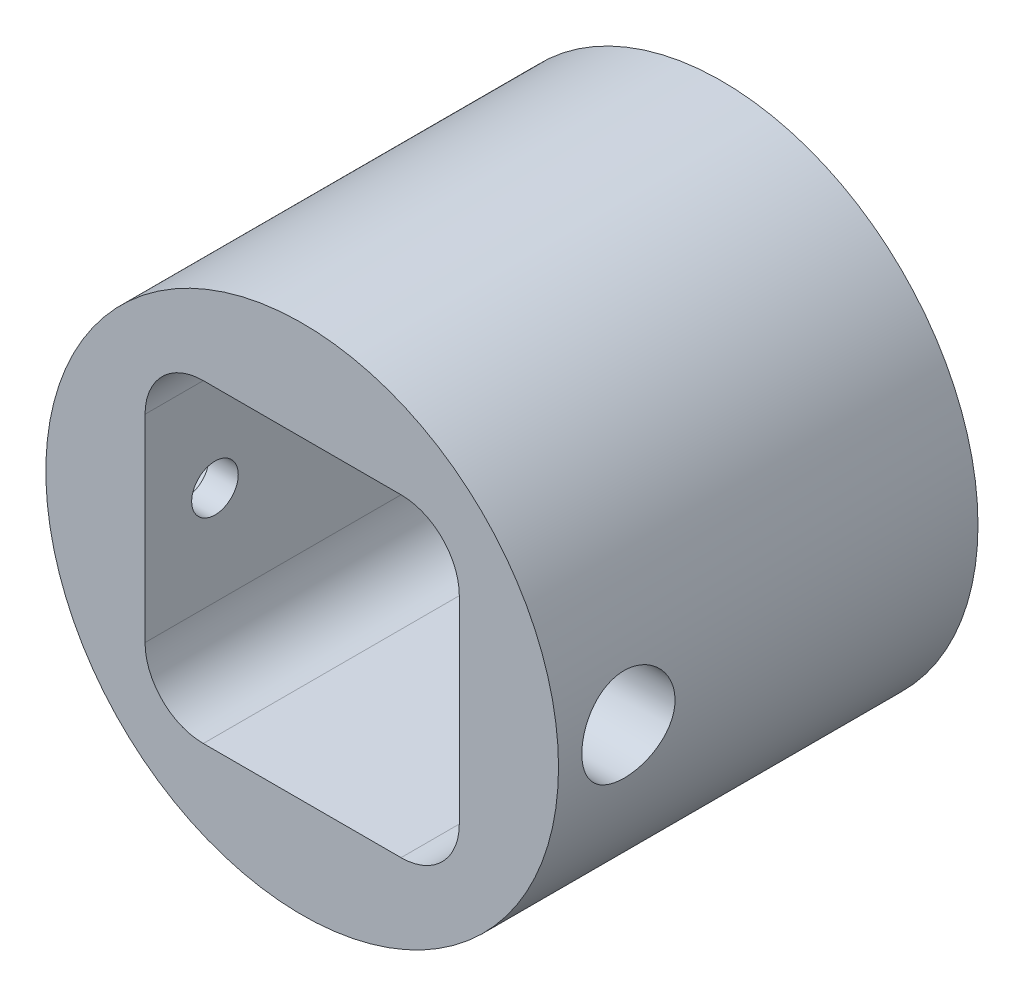
ISO-10303-21;
HEADER;
FILE_DESCRIPTION(('STEP AP214'),'2;1');
FILE_NAME('part.step','',(''),(''),'','','');
FILE_SCHEMA(('AUTOMOTIVE_DESIGN { 1 0 10303 214 1 1 1 1 }'));
ENDSEC;
DATA;
#1=APPLICATION_CONTEXT('core data for automotive mechanical design processes');
#2=APPLICATION_PROTOCOL_DEFINITION('international standard','automotive_design',2000,#1);
#3=PRODUCT_CONTEXT('',#1,'mechanical');
#4=PRODUCT('Part','Part','',(#3));
#5=PRODUCT_RELATED_PRODUCT_CATEGORY('part','',(#4));
#6=PRODUCT_DEFINITION_FORMATION('','',#4);
#7=PRODUCT_DEFINITION_CONTEXT('part definition',#1,'design');
#8=PRODUCT_DEFINITION('design','',#6,#7);
#9=PRODUCT_DEFINITION_SHAPE('','',#8);
#10=(LENGTH_UNIT() NAMED_UNIT(*) SI_UNIT(.MILLI.,.METRE.));
#11=(NAMED_UNIT(*) PLANE_ANGLE_UNIT() SI_UNIT($,.RADIAN.));
#12=(NAMED_UNIT(*) SI_UNIT($,.STERADIAN.) SOLID_ANGLE_UNIT());
#13=UNCERTAINTY_MEASURE_WITH_UNIT(LENGTH_MEASURE(1.E-05),#10,'distance_accuracy_value','');
#14=(GEOMETRIC_REPRESENTATION_CONTEXT(3) GLOBAL_UNCERTAINTY_ASSIGNED_CONTEXT((#13)) GLOBAL_UNIT_ASSIGNED_CONTEXT((#10,
#11,#12)) REPRESENTATION_CONTEXT('',''));
#15=CARTESIAN_POINT('',(0.,0.,0.));
#16=DIRECTION('',(0.,0.,1.));
#17=DIRECTION('',(1.,0.,0.));
#18=AXIS2_PLACEMENT_3D('',#15,#16,#17);
#19=CARTESIAN_POINT('',(-11.,0.,15.));
#20=DIRECTION('',(1.,0.,0.));
#21=DIRECTION('',(0.,0.,-1.));
#22=AXIS2_PLACEMENT_3D('',#19,#20,#21);
#23=CYLINDRICAL_SURFACE('',#22,0.999999999999998);
#24=CARTESIAN_POINT('',(8.,0.,15.));
#25=DIRECTION('',(1.,0.,0.));
#26=DIRECTION('',(0.,0.,-1.));
#27=AXIS2_PLACEMENT_3D('',#24,#25,#26);
#28=CIRCLE('',#27,0.999999999999998);
#29=CARTESIAN_POINT('',(8.,0.,14.));
#30=VERTEX_POINT('',#29);
#31=EDGE_CURVE('E186',#30,#30,#28,.F.);
#32=ORIENTED_EDGE('',*,*,#31,.F.);
#33=EDGE_LOOP('',(#32));
#34=FACE_BOUND('',#33,.T.);
#35=CARTESIAN_POINT('',(6.74264068711935,0.,15.));
#36=DIRECTION('',(-1.,0.,0.));
#37=DIRECTION('',(0.,-1.,0.));
#38=AXIS2_PLACEMENT_3D('',#35,#36,#37);
#39=CIRCLE('',#38,0.999999999999998);
#40=CARTESIAN_POINT('',(6.74264068711935,-0.999999999999998,15.));
#41=VERTEX_POINT('',#40);
#42=EDGE_CURVE('E177',#41,#41,#39,.F.);
#43=ORIENTED_EDGE('',*,*,#42,.F.);
#44=EDGE_LOOP('',(#43));
#45=FACE_BOUND('',#44,.T.);
#46=ADVANCED_FACE('F37',(#34,#45),#23,.F.);
#47=CARTESIAN_POINT('',(-4.24264068711929,4.24264068711928,18.));
#48=DIRECTION('',(0.,0.,-1.));
#49=DIRECTION('',(-1.,0.,0.));
#50=AXIS2_PLACEMENT_3D('',#47,#48,#49);
#51=CYLINDRICAL_SURFACE('',#50,1.5);
#52=CARTESIAN_POINT('',(-4.24264068711929,4.24264068711928,0.));
#53=DIRECTION('',(0.,0.,1.));
#54=DIRECTION('',(1.,0.,0.));
#55=AXIS2_PLACEMENT_3D('',#52,#53,#54);
#56=CIRCLE('',#55,1.5);
#57=CARTESIAN_POINT('',(-2.74264068711929,4.24264068711928,0.));
#58=VERTEX_POINT('',#57);
#59=EDGE_CURVE('E202',#58,#58,#56,.T.);
#60=ORIENTED_EDGE('',*,*,#59,.F.);
#61=EDGE_LOOP('',(#60));
#62=FACE_BOUND('',#61,.T.);
#63=CARTESIAN_POINT('',(-4.24264068711929,4.24264068711928,2.));
#64=DIRECTION('',(0.,0.,1.));
#65=DIRECTION('',(1.,0.,0.));
#66=AXIS2_PLACEMENT_3D('',#63,#64,#65);
#67=CIRCLE('',#66,1.5);
#68=CARTESIAN_POINT('',(-2.74264068711929,4.24264068711928,2.));
#69=VERTEX_POINT('',#68);
#70=EDGE_CURVE('E174',#69,#69,#67,.T.);
#71=ORIENTED_EDGE('',*,*,#70,.T.);
#72=EDGE_LOOP('',(#71));
#73=FACE_BOUND('',#72,.T.);
#74=ADVANCED_FACE('F240',(#62,#73),#51,.F.);
#75=CARTESIAN_POINT('',(4.24264068711928,4.2426406871194,18.));
#76=DIRECTION('',(0.,0.,-1.));
#77=DIRECTION('',(-1.,0.,0.));
#78=AXIS2_PLACEMENT_3D('',#75,#76,#77);
#79=CYLINDRICAL_SURFACE('',#78,1.5);
#80=CARTESIAN_POINT('',(4.24264068711928,4.2426406871194,0.));
#81=DIRECTION('',(0.,0.,1.));
#82=DIRECTION('',(1.,0.,0.));
#83=AXIS2_PLACEMENT_3D('',#80,#81,#82);
#84=CIRCLE('',#83,1.5);
#85=CARTESIAN_POINT('',(5.74264068711929,4.2426406871194,0.));
#86=VERTEX_POINT('',#85);
#87=EDGE_CURVE('E199',#86,#86,#84,.T.);
#88=ORIENTED_EDGE('',*,*,#87,.F.);
#89=EDGE_LOOP('',(#88));
#90=FACE_BOUND('',#89,.T.);
#91=CARTESIAN_POINT('',(4.24264068711928,4.2426406871194,2.));
#92=DIRECTION('',(0.,0.,1.));
#93=DIRECTION('',(1.,0.,0.));
#94=AXIS2_PLACEMENT_3D('',#91,#92,#93);
#95=CIRCLE('',#94,1.5);
#96=CARTESIAN_POINT('',(5.74264068711929,4.2426406871194,2.));
#97=VERTEX_POINT('',#96);
#98=EDGE_CURVE('E171',#97,#97,#95,.T.);
#99=ORIENTED_EDGE('',*,*,#98,.T.);
#100=EDGE_LOOP('',(#99));
#101=FACE_BOUND('',#100,.T.);
#102=ADVANCED_FACE('F236',(#90,#101),#79,.F.);
#103=CARTESIAN_POINT('',(4.2426406871194,-4.24264068711917,18.));
#104=DIRECTION('',(0.,0.,-1.));
#105=DIRECTION('',(-1.,0.,0.));
#106=AXIS2_PLACEMENT_3D('',#103,#104,#105);
#107=CYLINDRICAL_SURFACE('',#106,1.5);
#108=CARTESIAN_POINT('',(4.2426406871194,-4.24264068711917,0.));
#109=DIRECTION('',(0.,0.,1.));
#110=DIRECTION('',(1.,0.,0.));
#111=AXIS2_PLACEMENT_3D('',#108,#109,#110);
#112=CIRCLE('',#111,1.5);
#113=CARTESIAN_POINT('',(5.7426406871194,-4.24264068711917,0.));
#114=VERTEX_POINT('',#113);
#115=EDGE_CURVE('E195',#114,#114,#112,.T.);
#116=ORIENTED_EDGE('',*,*,#115,.F.);
#117=EDGE_LOOP('',(#116));
#118=FACE_BOUND('',#117,.T.);
#119=CARTESIAN_POINT('',(4.2426406871194,-4.24264068711917,2.));
#120=DIRECTION('',(0.,0.,1.));
#121=DIRECTION('',(1.,0.,0.));
#122=AXIS2_PLACEMENT_3D('',#119,#120,#121);
#123=CIRCLE('',#122,1.5);
#124=CARTESIAN_POINT('',(5.7426406871194,-4.24264068711917,2.));
#125=VERTEX_POINT('',#124);
#126=EDGE_CURVE('E168',#125,#125,#123,.T.);
#127=ORIENTED_EDGE('',*,*,#126,.T.);
#128=EDGE_LOOP('',(#127));
#129=FACE_BOUND('',#128,.T.);
#130=ADVANCED_FACE('F232',(#118,#129),#107,.F.);
#131=CARTESIAN_POINT('',(-4.24264068711917,-4.24264068711929,18.));
#132=DIRECTION('',(0.,0.,-1.));
#133=DIRECTION('',(-1.,0.,0.));
#134=AXIS2_PLACEMENT_3D('',#131,#132,#133);
#135=CYLINDRICAL_SURFACE('',#134,1.5);
#136=CARTESIAN_POINT('',(-4.24264068711917,-4.24264068711929,0.));
#137=DIRECTION('',(0.,0.,1.));
#138=DIRECTION('',(1.,0.,0.));
#139=AXIS2_PLACEMENT_3D('',#136,#137,#138);
#140=CIRCLE('',#139,1.5);
#141=CARTESIAN_POINT('',(-2.74264068711917,-4.24264068711929,0.));
#142=VERTEX_POINT('',#141);
#143=EDGE_CURVE('E192',#142,#142,#140,.T.);
#144=ORIENTED_EDGE('',*,*,#143,.F.);
#145=EDGE_LOOP('',(#144));
#146=FACE_BOUND('',#145,.T.);
#147=CARTESIAN_POINT('',(-4.24264068711917,-4.24264068711929,2.));
#148=DIRECTION('',(0.,0.,1.));
#149=DIRECTION('',(1.,0.,0.));
#150=AXIS2_PLACEMENT_3D('',#147,#148,#149);
#151=CIRCLE('',#150,1.5);
#152=CARTESIAN_POINT('',(-2.74264068711917,-4.24264068711929,2.));
#153=VERTEX_POINT('',#152);
#154=EDGE_CURVE('E42',#153,#153,#151,.T.);
#155=ORIENTED_EDGE('',*,*,#154,.T.);
#156=EDGE_LOOP('',(#155));
#157=FACE_BOUND('',#156,.T.);
#158=ADVANCED_FACE('F229',(#146,#157),#135,.F.);
#159=CARTESIAN_POINT('',(0.,0.,18.));
#160=DIRECTION('',(0.,0.,-1.));
#161=DIRECTION('',(-1.,0.,0.));
#162=AXIS2_PLACEMENT_3D('',#159,#160,#161);
#163=CYLINDRICAL_SURFACE('',#162,11.);
#164=CARTESIAN_POINT('',(0.,0.,0.));
#165=DIRECTION('',(0.,0.,1.));
#166=DIRECTION('',(1.,0.,0.));
#167=AXIS2_PLACEMENT_3D('',#164,#165,#166);
#168=CIRCLE('',#167,11.);
#169=CARTESIAN_POINT('',(11.,0.,0.));
#170=VERTEX_POINT('',#169);
#171=EDGE_CURVE('E47',#170,#170,#168,.T.);
#172=ORIENTED_EDGE('',*,*,#171,.T.);
#173=EDGE_LOOP('',(#172));
#174=FACE_BOUND('',#173,.T.);
#175=CARTESIAN_POINT('',(0.,0.,18.));
#176=DIRECTION('',(0.,0.,1.));
#177=DIRECTION('',(1.,0.,0.));
#178=AXIS2_PLACEMENT_3D('',#175,#176,#177);
#179=CIRCLE('',#178,11.);
#180=CARTESIAN_POINT('',(11.,0.,18.));
#181=VERTEX_POINT('',#180);
#182=EDGE_CURVE('E11',#181,#181,#179,.T.);
#183=ORIENTED_EDGE('',*,*,#182,.F.);
#184=EDGE_LOOP('',(#183));
#185=FACE_BOUND('',#184,.T.);
#186=CARTESIAN_POINT('',(-11.,0.,17.));
#187=CARTESIAN_POINT('',(-10.9999980072786,-0.111357271644373,16.9999956813393));
#188=CARTESIAN_POINT('',(-10.9982915273343,-0.222771449918202,16.9906682425173));
#189=CARTESIAN_POINT('',(-10.99164847502,-0.442464406848308,16.9536265339751));
#190=CARTESIAN_POINT('',(-10.9867091072254,-0.550740387266073,16.9258963514186));
#191=CARTESIAN_POINT('',(-10.9741532323507,-0.760947572513747,16.852922870329));
#192=CARTESIAN_POINT('',(-10.9665390793192,-0.862884263930175,16.8076949678102));
#193=CARTESIAN_POINT('',(-10.949466714983,-1.0577120033845,16.7010526688082));
#194=CARTESIAN_POINT('',(-10.9400086703132,-1.15060386767904,16.6396397348118));
#195=CARTESIAN_POINT('',(-10.9201743349983,-1.32576444051238,16.5016340903573));
#196=CARTESIAN_POINT('',(-10.9097897259708,-1.40791622603346,16.4248941580192));
#197=CARTESIAN_POINT('',(-10.8893349521181,-1.55825357341079,16.2587296459102));
#198=CARTESIAN_POINT('',(-10.8792648091126,-1.62643816794977,16.1693041883109));
#199=CARTESIAN_POINT('',(-10.8604984020977,-1.74738695016477,15.9794872705402));
#200=CARTESIAN_POINT('',(-10.851812871101,-1.80003313265556,15.8790194647696));
#201=CARTESIAN_POINT('',(-10.836915832769,-1.88765546949978,15.670481349676));
#202=CARTESIAN_POINT('',(-10.8307041253674,-1.92263305283275,15.562411655975));
#203=CARTESIAN_POINT('',(-10.8215415351671,-1.97355197711315,15.3429853506434));
#204=CARTESIAN_POINT('',(-10.8185558462234,-1.98969666425445,15.2316774082904));
#205=CARTESIAN_POINT('',(-10.8160783143231,-2.00312248736688,15.0078955926854));
#206=CARTESIAN_POINT('',(-10.8165861769405,-2.00040521296643,14.895421818484));
#207=CARTESIAN_POINT('',(-10.8210066504918,-1.97634934427,14.673968085867));
#208=CARTESIAN_POINT('',(-10.8248771281426,-1.95524117699072,14.5649621321043));
#209=CARTESIAN_POINT('',(-10.8355206127391,-1.89536523340026,14.3520649816328));
#210=CARTESIAN_POINT('',(-10.8422937363232,-1.85659674743188,14.2481739906482));
#211=CARTESIAN_POINT('',(-10.8580238155272,-1.76227297789295,14.0477772092213));
#212=CARTESIAN_POINT('',(-10.8669929171435,-1.7066239037154,13.9513165573339));
#213=CARTESIAN_POINT('',(-10.8860962201172,-1.58018503374043,13.7690152630547));
#214=CARTESIAN_POINT('',(-10.8962305328347,-1.50939379023584,13.6831756373538));
#215=CARTESIAN_POINT('',(-10.9167064080854,-1.35343399418352,13.5232210035556));
#216=CARTESIAN_POINT('',(-10.9270488181647,-1.2680681726569,13.4492983115631));
#217=CARTESIAN_POINT('',(-10.9466375043709,-1.08604454069331,13.3167948665192));
#218=CARTESIAN_POINT('',(-10.9558837707156,-0.989386629498158,13.2582142503787));
#219=CARTESIAN_POINT('',(-10.9722553782534,-0.787327598497297,13.158032610215));
#220=CARTESIAN_POINT('',(-10.9793783255922,-0.681916780395493,13.116450731304));
#221=CARTESIAN_POINT('',(-10.9906820547088,-0.465448414462667,13.0516368075063));
#222=CARTESIAN_POINT('',(-10.994863130091,-0.354391431316065,13.0284029314261));
#223=CARTESIAN_POINT('',(-10.9997719337866,-0.1314386495785,13.0012102380809));
#224=CARTESIAN_POINT('',(-11.0005468934114,-0.019576012108935,12.9969877765459));
#225=CARTESIAN_POINT('',(-10.998686302475,0.203257238970966,13.0072317981815));
#226=CARTESIAN_POINT('',(-10.9960509090871,0.314227893453081,13.0216974200717));
#227=CARTESIAN_POINT('',(-10.9876950863245,0.531297097592757,13.0686877495619));
#228=CARTESIAN_POINT('',(-10.9819973157216,0.637425297458317,13.1010798691828));
#229=CARTESIAN_POINT('',(-10.9681529512222,0.84274471375661,13.1828608285219));
#230=CARTESIAN_POINT('',(-10.9600061989244,0.941935480960948,13.2322507676977));
#231=CARTESIAN_POINT('',(-10.9420497958484,1.13169524707493,13.3472146378029));
#232=CARTESIAN_POINT('',(-10.932223816146,1.22216445208488,13.4129506871559));
#233=CARTESIAN_POINT('',(-10.9120428807109,1.39088213822347,13.5585203766711));
#234=CARTESIAN_POINT('',(-10.901687878785,1.46912954974332,13.6383552494119));
#235=CARTESIAN_POINT('',(-10.8814603955764,1.6121773788768,13.8110468814485));
#236=CARTESIAN_POINT('',(-10.8715955212189,1.67679836741418,13.9040533065259));
#237=CARTESIAN_POINT('',(-10.8536151008102,1.78949986552013,14.0997561814065));
#238=CARTESIAN_POINT('',(-10.8454994922354,1.83758096630795,14.2024522846844));
#239=CARTESIAN_POINT('',(-10.8319954461548,1.91557945241746,14.4141507496917));
#240=CARTESIAN_POINT('',(-10.8265943801675,1.9455810786184,14.5231212307381));
#241=CARTESIAN_POINT('',(-10.8191012654539,1.98683040178554,14.7446629886311));
#242=CARTESIAN_POINT('',(-10.8170088681136,1.99808007453629,14.8572338848489));
#243=CARTESIAN_POINT('',(-10.8163869388262,2.00144313663184,15.0809853754636));
#244=CARTESIAN_POINT('',(-10.8178047454411,1.99383937001232,15.1921616714385));
#245=CARTESIAN_POINT('',(-10.8239270874703,1.96032846912814,15.4116236380174));
#246=CARTESIAN_POINT('',(-10.8286316059701,1.93442142905717,15.5199093234943));
#247=CARTESIAN_POINT('',(-10.8407757208091,1.86515567158476,15.7303761973954));
#248=CARTESIAN_POINT('',(-10.8482107929975,1.82182581019232,15.8325671602234));
#249=CARTESIAN_POINT('',(-10.8649817751485,1.71897473664823,16.0282744471647));
#250=CARTESIAN_POINT('',(-10.8743178082294,1.65945247569007,16.1217902088456));
#251=CARTESIAN_POINT('',(-10.8940032465147,1.52491543662799,16.2989128745956));
#252=CARTESIAN_POINT('',(-10.9043650783111,1.44969415553099,16.3823615698708));
#253=CARTESIAN_POINT('',(-10.9248399206865,1.28632651423364,16.5355470810122));
#254=CARTESIAN_POINT('',(-10.9349528735191,1.19817718680093,16.6052807403922));
#255=CARTESIAN_POINT('',(-10.9538897429719,1.0105711896463,16.7296002971235));
#256=CARTESIAN_POINT('',(-10.9627021317343,0.911025849790495,16.7840541851801));
#257=CARTESIAN_POINT('',(-10.9779326099335,0.704073905086344,16.8753792160741));
#258=CARTESIAN_POINT('',(-10.9843529858473,0.59667492548667,16.9122671592783));
#259=CARTESIAN_POINT('',(-10.9927407037649,0.407441749458407,16.9597754303022));
#260=CARTESIAN_POINT('',(-10.9954478027358,0.326725427276491,16.9748343329604));
#261=CARTESIAN_POINT('',(-10.9990781643304,0.164016342132204,16.9949480937949));
#262=CARTESIAN_POINT('',(-11.0000014678,0.0820236084408334,17.0000031810418));
#263=CARTESIAN_POINT('',(-11.,0.,17.));
#264=B_SPLINE_CURVE_WITH_KNOTS('',3,(#186,#187,#188,#189,#190,#191,#192,#193,#194,#195,#196,
#197,#198,#199,#200,#201,#202,#203,#204,#205,#206,#207,#208,#209,#210,#211,#212,#213,#214,#215,
#216,#217,#218,#219,#220,#221,#222,#223,#224,#225,#226,#227,#228,#229,#230,#231,#232,#233,#234,
#235,#236,#237,#238,#239,#240,#241,#242,#243,#244,#245,#246,#247,#248,#249,#250,#251,#252,#253,
#254,#255,#256,#257,#258,#259,#260,#261,#262,#263),.UNSPECIFIED.,.T.,.F.,(4,2,2,2,2,2,2,2,2,2,2,
2,2,2,2,2,2,2,2,2,2,2,2,2,2,2,2,2,2,2,2,2,2,2,2,2,2,2,4),(0.,0.333771891552332,
0.667832772072589,1.00160038286674,1.3353378446015,1.67245014596885,2.00958578663078,
2.3492195220365,2.6888257845573,3.02473021172645,3.36060633024202,3.69233367290895,
4.02407434678871,4.35769306461625,4.69134369321255,5.02993210441872,5.36852353704646,
5.70749527023811,6.04643316861453,6.38065600997364,6.71486344850797,7.0466314328543,
7.3784208807422,7.71364226795666,8.04889297616123,8.38831506130458,8.72772501252474,
9.06554101076156,9.40332141303601,9.73606509730371,10.0688070691931,10.4010002025896,
10.733214857769,11.0701111453004,11.4070848782946,11.7468860454293,12.0863615649816,
12.3322171022956,12.5780670098676),.UNSPECIFIED.);
#265=CARTESIAN_POINT('',(-11.,0.,17.));
#266=VERTEX_POINT('',#265);
#267=EDGE_CURVE('E196',#266,#266,#264,.T.);
#268=ORIENTED_EDGE('',*,*,#267,.T.);
#269=EDGE_LOOP('',(#268));
#270=FACE_BOUND('',#269,.T.);
#271=CARTESIAN_POINT('',(11.,0.,17.));
#272=CARTESIAN_POINT('',(10.9999980072786,-0.111357271644373,16.9999956813393));
#273=CARTESIAN_POINT('',(10.9982915273343,-0.222771449918202,16.9906682425173));
#274=CARTESIAN_POINT('',(10.99164847502,-0.442464406848308,16.9536265339751));
#275=CARTESIAN_POINT('',(10.9867091072254,-0.550740387266073,16.9258963514186));
#276=CARTESIAN_POINT('',(10.9741532323507,-0.760947572513747,16.852922870329));
#277=CARTESIAN_POINT('',(10.9665390793192,-0.862884263930175,16.8076949678102));
#278=CARTESIAN_POINT('',(10.949466714983,-1.0577120033845,16.7010526688082));
#279=CARTESIAN_POINT('',(10.9400086703132,-1.15060386767904,16.6396397348118));
#280=CARTESIAN_POINT('',(10.9201743349983,-1.32576444051238,16.5016340903573));
#281=CARTESIAN_POINT('',(10.9097897259708,-1.40791622603346,16.4248941580192));
#282=CARTESIAN_POINT('',(10.8893349521181,-1.55825357341079,16.2587296459102));
#283=CARTESIAN_POINT('',(10.8792648091126,-1.62643816794977,16.1693041883109));
#284=CARTESIAN_POINT('',(10.8604984020977,-1.74738695016477,15.9794872705402));
#285=CARTESIAN_POINT('',(10.851812871101,-1.80003313265556,15.8790194647696));
#286=CARTESIAN_POINT('',(10.836915832769,-1.88765546949978,15.670481349676));
#287=CARTESIAN_POINT('',(10.8307041253674,-1.92263305283275,15.562411655975));
#288=CARTESIAN_POINT('',(10.8215415351671,-1.97355197711315,15.3429853506434));
#289=CARTESIAN_POINT('',(10.8185558462234,-1.98969666425445,15.2316774082904));
#290=CARTESIAN_POINT('',(10.8160783143231,-2.00312248736688,15.0078955926854));
#291=CARTESIAN_POINT('',(10.8165861769405,-2.00040521296643,14.895421818484));
#292=CARTESIAN_POINT('',(10.8210066504918,-1.97634934427,14.673968085867));
#293=CARTESIAN_POINT('',(10.8248771281426,-1.95524117699072,14.5649621321043));
#294=CARTESIAN_POINT('',(10.8355206127391,-1.89536523340026,14.3520649816328));
#295=CARTESIAN_POINT('',(10.8422937363232,-1.85659674743188,14.2481739906482));
#296=CARTESIAN_POINT('',(10.8580238155272,-1.76227297789295,14.0477772092213));
#297=CARTESIAN_POINT('',(10.8669929171435,-1.7066239037154,13.9513165573339));
#298=CARTESIAN_POINT('',(10.8860962201172,-1.58018503374043,13.7690152630547));
#299=CARTESIAN_POINT('',(10.8962305328347,-1.50939379023584,13.6831756373538));
#300=CARTESIAN_POINT('',(10.9167064080854,-1.35343399418352,13.5232210035556));
#301=CARTESIAN_POINT('',(10.9270488181647,-1.2680681726569,13.4492983115631));
#302=CARTESIAN_POINT('',(10.9466375043709,-1.08604454069331,13.3167948665192));
#303=CARTESIAN_POINT('',(10.9558837707156,-0.989386629498158,13.2582142503787));
#304=CARTESIAN_POINT('',(10.9722553782534,-0.787327598497297,13.158032610215));
#305=CARTESIAN_POINT('',(10.9793783255922,-0.681916780395493,13.116450731304));
#306=CARTESIAN_POINT('',(10.9906820547088,-0.465448414462667,13.0516368075063));
#307=CARTESIAN_POINT('',(10.994863130091,-0.354391431316065,13.0284029314261));
#308=CARTESIAN_POINT('',(10.9997719337866,-0.1314386495785,13.0012102380809));
#309=CARTESIAN_POINT('',(11.0005468934114,-0.019576012108935,12.9969877765459));
#310=CARTESIAN_POINT('',(10.998686302475,0.203257238970966,13.0072317981815));
#311=CARTESIAN_POINT('',(10.9960509090871,0.314227893453081,13.0216974200717));
#312=CARTESIAN_POINT('',(10.9876950863245,0.531297097592757,13.0686877495619));
#313=CARTESIAN_POINT('',(10.9819973157216,0.637425297458317,13.1010798691828));
#314=CARTESIAN_POINT('',(10.9681529512222,0.84274471375661,13.1828608285219));
#315=CARTESIAN_POINT('',(10.9600061989244,0.941935480960948,13.2322507676977));
#316=CARTESIAN_POINT('',(10.9420497958484,1.13169524707493,13.3472146378029));
#317=CARTESIAN_POINT('',(10.932223816146,1.22216445208488,13.4129506871559));
#318=CARTESIAN_POINT('',(10.9120428807109,1.39088213822347,13.5585203766711));
#319=CARTESIAN_POINT('',(10.901687878785,1.46912954974332,13.6383552494119));
#320=CARTESIAN_POINT('',(10.8814603955764,1.6121773788768,13.8110468814485));
#321=CARTESIAN_POINT('',(10.8715955212189,1.67679836741418,13.9040533065259));
#322=CARTESIAN_POINT('',(10.8536151008102,1.78949986552013,14.0997561814065));
#323=CARTESIAN_POINT('',(10.8454994922354,1.83758096630795,14.2024522846844));
#324=CARTESIAN_POINT('',(10.8319954461548,1.91557945241746,14.4141507496917));
#325=CARTESIAN_POINT('',(10.8265943801675,1.9455810786184,14.5231212307381));
#326=CARTESIAN_POINT('',(10.8191012654539,1.98683040178554,14.7446629886311));
#327=CARTESIAN_POINT('',(10.8170088681136,1.99808007453629,14.8572338848489));
#328=CARTESIAN_POINT('',(10.8163869388262,2.00144313663184,15.0809853754636));
#329=CARTESIAN_POINT('',(10.8178047454411,1.99383937001232,15.1921616714385));
#330=CARTESIAN_POINT('',(10.8239270874703,1.96032846912814,15.4116236380174));
#331=CARTESIAN_POINT('',(10.8286316059701,1.93442142905717,15.5199093234943));
#332=CARTESIAN_POINT('',(10.8407757208091,1.86515567158476,15.7303761973954));
#333=CARTESIAN_POINT('',(10.8482107929975,1.82182581019232,15.8325671602234));
#334=CARTESIAN_POINT('',(10.8649817751485,1.71897473664823,16.0282744471647));
#335=CARTESIAN_POINT('',(10.8743178082294,1.65945247569007,16.1217902088456));
#336=CARTESIAN_POINT('',(10.8940032465147,1.52491543662799,16.2989128745956));
#337=CARTESIAN_POINT('',(10.9043650783111,1.44969415553099,16.3823615698708));
#338=CARTESIAN_POINT('',(10.9248399206865,1.28632651423364,16.5355470810122));
#339=CARTESIAN_POINT('',(10.9349528735191,1.19817718680093,16.6052807403922));
#340=CARTESIAN_POINT('',(10.9538897429719,1.0105711896463,16.7296002971235));
#341=CARTESIAN_POINT('',(10.9627021317343,0.911025849790495,16.7840541851801));
#342=CARTESIAN_POINT('',(10.9779326099335,0.704073905086344,16.8753792160741));
#343=CARTESIAN_POINT('',(10.9843529858473,0.59667492548667,16.9122671592783));
#344=CARTESIAN_POINT('',(10.9927407037649,0.407441749458407,16.9597754303022));
#345=CARTESIAN_POINT('',(10.9954478027358,0.326725427276491,16.9748343329604));
#346=CARTESIAN_POINT('',(10.9990781643304,0.164016342132204,16.9949480937949));
#347=CARTESIAN_POINT('',(11.0000014678,0.0820236084408334,17.0000031810418));
#348=CARTESIAN_POINT('',(11.,0.,17.));
#349=B_SPLINE_CURVE_WITH_KNOTS('',3,(#271,#272,#273,#274,#275,#276,#277,#278,#279,#280,#281,
#282,#283,#284,#285,#286,#287,#288,#289,#290,#291,#292,#293,#294,#295,#296,#297,#298,#299,#300,
#301,#302,#303,#304,#305,#306,#307,#308,#309,#310,#311,#312,#313,#314,#315,#316,#317,#318,#319,
#320,#321,#322,#323,#324,#325,#326,#327,#328,#329,#330,#331,#332,#333,#334,#335,#336,#337,#338,
#339,#340,#341,#342,#343,#344,#345,#346,#347,#348),.UNSPECIFIED.,.T.,.F.,(4,2,2,2,2,2,2,2,2,2,2,
2,2,2,2,2,2,2,2,2,2,2,2,2,2,2,2,2,2,2,2,2,2,2,2,2,2,2,4),(0.,0.333771891552332,
0.667832772072589,1.00160038286674,1.3353378446015,1.67245014596885,2.00958578663078,
2.3492195220365,2.6888257845573,3.02473021172645,3.36060633024202,3.69233367290895,
4.02407434678871,4.35769306461625,4.69134369321255,5.02993210441872,5.36852353704646,
5.70749527023811,6.04643316861453,6.38065600997364,6.71486344850797,7.0466314328543,
7.3784208807422,7.71364226795666,8.04889297616123,8.38831506130458,8.72772501252474,
9.06554101076156,9.40332141303601,9.73606509730371,10.0688070691931,10.4010002025896,
10.733214857769,11.0701111453004,11.4070848782946,11.7468860454293,12.0863615649816,
12.3322171022956,12.5780670098676),.UNSPECIFIED.);
#350=CARTESIAN_POINT('',(11.,0.,17.));
#351=VERTEX_POINT('',#350);
#352=EDGE_CURVE('E191',#351,#351,#349,.T.);
#353=ORIENTED_EDGE('',*,*,#352,.F.);
#354=EDGE_LOOP('',(#353));
#355=FACE_BOUND('',#354,.T.);
#356=ADVANCED_FACE('F39',(#174,#185,#270,#355),#163,.T.);
#357=CARTESIAN_POINT('',(-6.74264068711929,0.,15.));
#358=DIRECTION('',(-1.,0.,0.));
#359=DIRECTION('',(0.,0.,1.));
#360=AXIS2_PLACEMENT_3D('',#357,#358,#359);
#361=CIRCLE('',#360,0.999999999999998);
#362=CARTESIAN_POINT('',(-6.74264068711929,0.,16.));
#363=VERTEX_POINT('',#362);
#364=EDGE_CURVE('E180',#363,#363,#361,.F.);
#365=ORIENTED_EDGE('',*,*,#364,.T.);
#366=EDGE_LOOP('',(#365));
#367=FACE_BOUND('',#366,.T.);
#368=CARTESIAN_POINT('',(-8.,0.,15.));
#369=DIRECTION('',(1.,0.,0.));
#370=DIRECTION('',(0.,0.,-1.));
#371=AXIS2_PLACEMENT_3D('',#368,#369,#370);
#372=CIRCLE('',#371,0.999999999999998);
#373=CARTESIAN_POINT('',(-8.,0.,14.));
#374=VERTEX_POINT('',#373);
#375=EDGE_CURVE('E190',#374,#374,#372,.F.);
#376=ORIENTED_EDGE('',*,*,#375,.T.);
#377=EDGE_LOOP('',(#376));
#378=FACE_BOUND('',#377,.T.);
#379=ADVANCED_FACE('F224',(#367,#378),#23,.F.);
#380=CARTESIAN_POINT('',(0.,0.,18.));
#381=DIRECTION('',(0.,0.,1.));
#382=DIRECTION('',(1.,0.,0.));
#383=AXIS2_PLACEMENT_3D('',#380,#381,#382);
#384=PLANE('',#383);
#385=DIRECTION('',(0.,-1.,0.));
#386=VECTOR('',#385,1.);
#387=CARTESIAN_POINT('',(-6.74264068711929,0.,18.));
#388=LINE('',#387,#386);
#389=CARTESIAN_POINT('',(-6.74264068711929,4.24264068711928,18.));
#390=VERTEX_POINT('',#389);
#391=CARTESIAN_POINT('',(-6.74264068711952,-4.24264068711929,18.));
#392=VERTEX_POINT('',#391);
#393=EDGE_CURVE('E55',#390,#392,#388,.T.);
#394=ORIENTED_EDGE('',*,*,#393,.F.);
#395=CARTESIAN_POINT('',(-4.24264068711929,4.24264068711928,18.));
#396=DIRECTION('',(0.,0.,1.));
#397=DIRECTION('',(1.,0.,0.));
#398=AXIS2_PLACEMENT_3D('',#395,#396,#397);
#399=CIRCLE('',#398,2.5);
#400=CARTESIAN_POINT('',(-4.24264068711929,6.74264068711929,18.));
#401=VERTEX_POINT('',#400);
#402=EDGE_CURVE('E155',#401,#390,#399,.T.);
#403=ORIENTED_EDGE('',*,*,#402,.F.);
#404=DIRECTION('',(1.,0.,0.));
#405=VECTOR('',#404,1.);
#406=CARTESIAN_POINT('',(0.,6.74264068711929,18.));
#407=LINE('',#406,#405);
#408=CARTESIAN_POINT('',(4.24264068711928,6.74264068711932,18.));
#409=VERTEX_POINT('',#408);
#410=EDGE_CURVE('E153',#401,#409,#407,.T.);
#411=ORIENTED_EDGE('',*,*,#410,.T.);
#412=CARTESIAN_POINT('',(4.24264068711928,4.24264068711928,18.));
#413=DIRECTION('',(0.,0.,1.));
#414=DIRECTION('',(1.,0.,0.));
#415=AXIS2_PLACEMENT_3D('',#412,#413,#414);
#416=CIRCLE('',#415,2.50000000000007);
#417=CARTESIAN_POINT('',(6.74264068711935,4.24264068711928,18.));
#418=VERTEX_POINT('',#417);
#419=EDGE_CURVE('E124',#418,#409,#416,.T.);
#420=ORIENTED_EDGE('',*,*,#419,.F.);
#421=DIRECTION('',(0.,-1.,0.));
#422=VECTOR('',#421,1.);
#423=CARTESIAN_POINT('',(6.74264068711935,0.,18.));
#424=LINE('',#423,#422);
#425=CARTESIAN_POINT('',(6.74264068711947,-4.24264068711929,18.));
#426=VERTEX_POINT('',#425);
#427=EDGE_CURVE('E149',#418,#426,#424,.T.);
#428=ORIENTED_EDGE('',*,*,#427,.T.);
#429=CARTESIAN_POINT('',(4.24264068711928,-4.24264068711929,18.));
#430=DIRECTION('',(0.,0.,1.));
#431=DIRECTION('',(1.,0.,0.));
#432=AXIS2_PLACEMENT_3D('',#429,#430,#431);
#433=CIRCLE('',#432,2.5000000000003);
#434=CARTESIAN_POINT('',(4.24264068711928,-6.74264068711944,18.));
#435=VERTEX_POINT('',#434);
#436=EDGE_CURVE('E146',#435,#426,#433,.T.);
#437=ORIENTED_EDGE('',*,*,#436,.F.);
#438=DIRECTION('',(1.,0.,0.));
#439=VECTOR('',#438,1.);
#440=CARTESIAN_POINT('',(0.,-6.74264068711929,18.));
#441=LINE('',#440,#439);
#442=CARTESIAN_POINT('',(-4.24264068711929,-6.7426406871194,18.));
#443=VERTEX_POINT('',#442);
#444=EDGE_CURVE('E143',#443,#435,#441,.T.);
#445=ORIENTED_EDGE('',*,*,#444,.F.);
#446=CARTESIAN_POINT('',(-4.24264068711929,-4.24264068711929,18.));
#447=DIRECTION('',(0.,0.,1.));
#448=DIRECTION('',(1.,0.,0.));
#449=AXIS2_PLACEMENT_3D('',#446,#447,#448);
#450=CIRCLE('',#449,2.50000000000023);
#451=EDGE_CURVE('E140',#392,#443,#450,.T.);
#452=ORIENTED_EDGE('',*,*,#451,.F.);
#453=EDGE_LOOP('',(#394,#403,#411,#420,#428,#437,#445,#452));
#454=FACE_BOUND('',#453,.T.);
#455=ORIENTED_EDGE('',*,*,#182,.T.);
#456=EDGE_LOOP('',(#455));
#457=FACE_BOUND('',#456,.T.);
#458=ADVANCED_FACE('F227',(#454,#457),#384,.T.);
#459=CARTESIAN_POINT('',(0.,0.,0.));
#460=DIRECTION('',(0.,0.,1.));
#461=DIRECTION('',(1.,0.,0.));
#462=AXIS2_PLACEMENT_3D('',#459,#460,#461);
#463=PLANE('',#462);
#464=ORIENTED_EDGE('',*,*,#171,.F.);
#465=EDGE_LOOP('',(#464));
#466=FACE_BOUND('',#465,.T.);
#467=ORIENTED_EDGE('',*,*,#59,.T.);
#468=EDGE_LOOP('',(#467));
#469=FACE_BOUND('',#468,.T.);
#470=ORIENTED_EDGE('',*,*,#87,.T.);
#471=EDGE_LOOP('',(#470));
#472=FACE_BOUND('',#471,.T.);
#473=ORIENTED_EDGE('',*,*,#115,.T.);
#474=EDGE_LOOP('',(#473));
#475=FACE_BOUND('',#474,.T.);
#476=ORIENTED_EDGE('',*,*,#143,.T.);
#477=EDGE_LOOP('',(#476));
#478=FACE_BOUND('',#477,.T.);
#479=ADVANCED_FACE('F221',(#466,#469,#472,#475,#478),#463,.F.);
#480=CARTESIAN_POINT('',(-13.,0.,15.));
#481=DIRECTION('',(1.,0.,0.));
#482=DIRECTION('',(0.,0.,-1.));
#483=AXIS2_PLACEMENT_3D('',#480,#481,#482);
#484=CYLINDRICAL_SURFACE('',#483,2.);
#485=CARTESIAN_POINT('',(-8.,0.,15.));
#486=DIRECTION('',(1.,0.,0.));
#487=DIRECTION('',(0.,0.,-1.));
#488=AXIS2_PLACEMENT_3D('',#485,#486,#487);
#489=CIRCLE('',#488,2.);
#490=CARTESIAN_POINT('',(-8.,0.,13.));
#491=VERTEX_POINT('',#490);
#492=EDGE_CURVE('E187',#491,#491,#489,.T.);
#493=ORIENTED_EDGE('',*,*,#492,.T.);
#494=EDGE_LOOP('',(#493));
#495=FACE_BOUND('',#494,.T.);
#496=ORIENTED_EDGE('',*,*,#267,.F.);
#497=EDGE_LOOP('',(#496));
#498=FACE_BOUND('',#497,.T.);
#499=ADVANCED_FACE('F215',(#495,#498),#484,.F.);
#500=CARTESIAN_POINT('',(-8.,0.,15.));
#501=DIRECTION('',(1.,0.,0.));
#502=DIRECTION('',(0.,0.,-1.));
#503=AXIS2_PLACEMENT_3D('',#500,#501,#502);
#504=PLANE('',#503);
#505=ORIENTED_EDGE('',*,*,#492,.F.);
#506=EDGE_LOOP('',(#505));
#507=FACE_BOUND('',#506,.T.);
#508=ORIENTED_EDGE('',*,*,#375,.F.);
#509=EDGE_LOOP('',(#508));
#510=FACE_BOUND('',#509,.T.);
#511=ADVANCED_FACE('F220',(#507,#510),#504,.F.);
#512=CARTESIAN_POINT('',(13.,0.,15.));
#513=DIRECTION('',(-1.,0.,0.));
#514=DIRECTION('',(0.,0.,1.));
#515=AXIS2_PLACEMENT_3D('',#512,#513,#514);
#516=CYLINDRICAL_SURFACE('',#515,2.);
#517=CARTESIAN_POINT('',(8.,0.,15.));
#518=DIRECTION('',(1.,0.,0.));
#519=DIRECTION('',(0.,0.,-1.));
#520=AXIS2_PLACEMENT_3D('',#517,#518,#519);
#521=CIRCLE('',#520,2.);
#522=CARTESIAN_POINT('',(8.,0.,13.));
#523=VERTEX_POINT('',#522);
#524=EDGE_CURVE('E183',#523,#523,#521,.T.);
#525=ORIENTED_EDGE('',*,*,#524,.F.);
#526=EDGE_LOOP('',(#525));
#527=FACE_BOUND('',#526,.T.);
#528=ORIENTED_EDGE('',*,*,#352,.T.);
#529=EDGE_LOOP('',(#528));
#530=FACE_BOUND('',#529,.T.);
#531=ADVANCED_FACE('F292',(#527,#530),#516,.F.);
#532=CARTESIAN_POINT('',(8.,0.,15.));
#533=DIRECTION('',(1.,0.,0.));
#534=DIRECTION('',(0.,0.,-1.));
#535=AXIS2_PLACEMENT_3D('',#532,#533,#534);
#536=PLANE('',#535);
#537=ORIENTED_EDGE('',*,*,#524,.T.);
#538=EDGE_LOOP('',(#537));
#539=FACE_BOUND('',#538,.T.);
#540=ORIENTED_EDGE('',*,*,#31,.T.);
#541=EDGE_LOOP('',(#540));
#542=FACE_BOUND('',#541,.T.);
#543=ADVANCED_FACE('F273',(#539,#542),#536,.T.);
#544=CARTESIAN_POINT('',(-6.74264068711929,0.,2.));
#545=DIRECTION('',(-1.,0.,0.));
#546=DIRECTION('',(0.,0.,1.));
#547=AXIS2_PLACEMENT_3D('',#544,#545,#546);
#548=PLANE('',#547);
#549=ORIENTED_EDGE('',*,*,#393,.T.);
#550=DIRECTION('',(0.,0.,1.));
#551=VECTOR('',#550,1.);
#552=CARTESIAN_POINT('',(-6.7426406871194,-4.24264068711929,2.));
#553=LINE('',#552,#551);
#554=CARTESIAN_POINT('',(-6.7426406871194,-4.24264068711929,2.));
#555=VERTEX_POINT('',#554);
#556=EDGE_CURVE('E91',#555,#392,#553,.T.);
#557=ORIENTED_EDGE('',*,*,#556,.F.);
#558=DIRECTION('',(0.,-1.,0.));
#559=VECTOR('',#558,1.);
#560=CARTESIAN_POINT('',(-6.74264068711929,0.,2.));
#561=LINE('',#560,#559);
#562=CARTESIAN_POINT('',(-6.74264068711929,4.24264068711928,2.));
#563=VERTEX_POINT('',#562);
#564=EDGE_CURVE('E157',#563,#555,#561,.T.);
#565=ORIENTED_EDGE('',*,*,#564,.F.);
#566=DIRECTION('',(0.,0.,1.));
#567=VECTOR('',#566,1.);
#568=CARTESIAN_POINT('',(-6.74264068711929,4.24264068711928,2.));
#569=LINE('',#568,#567);
#570=EDGE_CURVE('E63',#563,#390,#569,.T.);
#571=ORIENTED_EDGE('',*,*,#570,.T.);
#572=EDGE_LOOP('',(#549,#557,#565,#571));
#573=FACE_BOUND('',#572,.T.);
#574=ORIENTED_EDGE('',*,*,#364,.F.);
#575=EDGE_LOOP('',(#574));
#576=FACE_BOUND('',#575,.T.);
#577=ADVANCED_FACE('F265',(#573,#576),#548,.F.);
#578=CARTESIAN_POINT('',(6.74264068711935,0.,2.));
#579=DIRECTION('',(-1.,0.,0.));
#580=DIRECTION('',(0.,-1.,0.));
#581=AXIS2_PLACEMENT_3D('',#578,#579,#580);
#582=PLANE('',#581);
#583=ORIENTED_EDGE('',*,*,#427,.F.);
#584=DIRECTION('',(0.,0.,1.));
#585=VECTOR('',#584,1.);
#586=CARTESIAN_POINT('',(6.74264068711935,4.24264068711928,2.));
#587=LINE('',#586,#585);
#588=CARTESIAN_POINT('',(6.74264068711935,4.24264068711928,2.));
#589=VERTEX_POINT('',#588);
#590=EDGE_CURVE('E126',#589,#418,#587,.T.);
#591=ORIENTED_EDGE('',*,*,#590,.F.);
#592=DIRECTION('',(0.,-1.,0.));
#593=VECTOR('',#592,1.);
#594=CARTESIAN_POINT('',(6.74264068711935,0.,2.));
#595=LINE('',#594,#593);
#596=CARTESIAN_POINT('',(6.74264068711947,-4.24264068711929,2.));
#597=VERTEX_POINT('',#596);
#598=EDGE_CURVE('E132',#589,#597,#595,.T.);
#599=ORIENTED_EDGE('',*,*,#598,.T.);
#600=DIRECTION('',(0.,0.,1.));
#601=VECTOR('',#600,1.);
#602=CARTESIAN_POINT('',(6.74264068711947,-4.24264068711929,2.));
#603=LINE('',#602,#601);
#604=EDGE_CURVE('E161',#597,#426,#603,.T.);
#605=ORIENTED_EDGE('',*,*,#604,.T.);
#606=EDGE_LOOP('',(#583,#591,#599,#605));
#607=FACE_BOUND('',#606,.T.);
#608=ORIENTED_EDGE('',*,*,#42,.T.);
#609=EDGE_LOOP('',(#608));
#610=FACE_BOUND('',#609,.T.);
#611=ADVANCED_FACE('F262',(#607,#610),#582,.T.);
#612=CARTESIAN_POINT('',(-4.24264068711929,4.24264068711928,2.));
#613=DIRECTION('',(0.,0.,1.));
#614=DIRECTION('',(1.,0.,0.));
#615=AXIS2_PLACEMENT_3D('',#612,#613,#614);
#616=CYLINDRICAL_SURFACE('',#615,2.5);
#617=ORIENTED_EDGE('',*,*,#402,.T.);
#618=ORIENTED_EDGE('',*,*,#570,.F.);
#619=CARTESIAN_POINT('',(-4.24264068711929,4.24264068711928,2.));
#620=DIRECTION('',(0.,0.,1.));
#621=DIRECTION('',(1.,0.,0.));
#622=AXIS2_PLACEMENT_3D('',#619,#620,#621);
#623=CIRCLE('',#622,2.5);
#624=CARTESIAN_POINT('',(-4.24264068711929,6.74264068711929,2.));
#625=VERTEX_POINT('',#624);
#626=EDGE_CURVE('E117',#625,#563,#623,.T.);
#627=ORIENTED_EDGE('',*,*,#626,.F.);
#628=DIRECTION('',(0.,0.,1.));
#629=VECTOR('',#628,1.);
#630=CARTESIAN_POINT('',(-4.24264068711929,6.74264068711929,2.));
#631=LINE('',#630,#629);
#632=EDGE_CURVE('E113',#625,#401,#631,.T.);
#633=ORIENTED_EDGE('',*,*,#632,.T.);
#634=EDGE_LOOP('',(#617,#618,#627,#633));
#635=FACE_BOUND('',#634,.T.);
#636=ADVANCED_FACE('F264',(#635),#616,.F.);
#637=CARTESIAN_POINT('',(0.,6.74264068711929,2.));
#638=DIRECTION('',(0.,-1.,0.));
#639=DIRECTION('',(1.,0.,0.));
#640=AXIS2_PLACEMENT_3D('',#637,#638,#639);
#641=PLANE('',#640);
#642=ORIENTED_EDGE('',*,*,#410,.F.);
#643=ORIENTED_EDGE('',*,*,#632,.F.);
#644=DIRECTION('',(1.,0.,0.));
#645=VECTOR('',#644,1.);
#646=CARTESIAN_POINT('',(0.,6.74264068711929,2.));
#647=LINE('',#646,#645);
#648=CARTESIAN_POINT('',(4.24264068711928,6.74264068711932,2.));
#649=VERTEX_POINT('',#648);
#650=EDGE_CURVE('E107',#625,#649,#647,.T.);
#651=ORIENTED_EDGE('',*,*,#650,.T.);
#652=DIRECTION('',(0.,0.,1.));
#653=VECTOR('',#652,1.);
#654=CARTESIAN_POINT('',(4.24264068711928,6.74264068711932,2.));
#655=LINE('',#654,#653);
#656=EDGE_CURVE('E111',#649,#409,#655,.T.);
#657=ORIENTED_EDGE('',*,*,#656,.T.);
#658=EDGE_LOOP('',(#642,#643,#651,#657));
#659=FACE_BOUND('',#658,.T.);
#660=ADVANCED_FACE('F110',(#659),#641,.T.);
#661=CARTESIAN_POINT('',(4.24264068711928,4.24264068711928,2.));
#662=DIRECTION('',(0.,0.,1.));
#663=DIRECTION('',(1.,0.,0.));
#664=AXIS2_PLACEMENT_3D('',#661,#662,#663);
#665=CYLINDRICAL_SURFACE('',#664,2.50000000000007);
#666=ORIENTED_EDGE('',*,*,#419,.T.);
#667=ORIENTED_EDGE('',*,*,#656,.F.);
#668=CARTESIAN_POINT('',(4.24264068711928,4.24264068711928,2.));
#669=DIRECTION('',(0.,0.,1.));
#670=DIRECTION('',(1.,0.,0.));
#671=AXIS2_PLACEMENT_3D('',#668,#669,#670);
#672=CIRCLE('',#671,2.50000000000007);
#673=EDGE_CURVE('E118',#589,#649,#672,.T.);
#674=ORIENTED_EDGE('',*,*,#673,.F.);
#675=ORIENTED_EDGE('',*,*,#590,.T.);
#676=EDGE_LOOP('',(#666,#667,#674,#675));
#677=FACE_BOUND('',#676,.T.);
#678=ADVANCED_FACE('F122',(#677),#665,.F.);
#679=CARTESIAN_POINT('',(4.24264068711928,-4.24264068711929,2.));
#680=DIRECTION('',(0.,0.,1.));
#681=DIRECTION('',(1.,0.,0.));
#682=AXIS2_PLACEMENT_3D('',#679,#680,#681);
#683=CYLINDRICAL_SURFACE('',#682,2.5000000000003);
#684=ORIENTED_EDGE('',*,*,#436,.T.);
#685=ORIENTED_EDGE('',*,*,#604,.F.);
#686=CARTESIAN_POINT('',(4.24264068711928,-4.24264068711929,2.));
#687=DIRECTION('',(0.,0.,1.));
#688=DIRECTION('',(1.,0.,0.));
#689=AXIS2_PLACEMENT_3D('',#686,#687,#688);
#690=CIRCLE('',#689,2.5000000000003);
#691=CARTESIAN_POINT('',(4.24264068711928,-6.74264068711944,2.));
#692=VERTEX_POINT('',#691);
#693=EDGE_CURVE('E134',#692,#597,#690,.T.);
#694=ORIENTED_EDGE('',*,*,#693,.F.);
#695=DIRECTION('',(0.,0.,1.));
#696=VECTOR('',#695,1.);
#697=CARTESIAN_POINT('',(4.24264068711928,-6.74264068711944,2.));
#698=LINE('',#697,#696);
#699=EDGE_CURVE('E163',#692,#435,#698,.T.);
#700=ORIENTED_EDGE('',*,*,#699,.T.);
#701=EDGE_LOOP('',(#684,#685,#694,#700));
#702=FACE_BOUND('',#701,.T.);
#703=ADVANCED_FACE('F279',(#702),#683,.F.);
#704=CARTESIAN_POINT('',(0.,-6.74264068711929,2.));
#705=DIRECTION('',(0.,-1.,0.));
#706=DIRECTION('',(0.,0.,-1.));
#707=AXIS2_PLACEMENT_3D('',#704,#705,#706);
#708=PLANE('',#707);
#709=ORIENTED_EDGE('',*,*,#444,.T.);
#710=ORIENTED_EDGE('',*,*,#699,.F.);
#711=DIRECTION('',(1.,0.,0.));
#712=VECTOR('',#711,1.);
#713=CARTESIAN_POINT('',(0.,-6.74264068711929,2.));
#714=LINE('',#713,#712);
#715=CARTESIAN_POINT('',(-4.24264068711929,-6.7426406871194,2.));
#716=VERTEX_POINT('',#715);
#717=EDGE_CURVE('E481',#716,#692,#714,.T.);
#718=ORIENTED_EDGE('',*,*,#717,.F.);
#719=DIRECTION('',(0.,0.,1.));
#720=VECTOR('',#719,1.);
#721=CARTESIAN_POINT('',(-4.24264068711929,-6.7426406871194,2.));
#722=LINE('',#721,#720);
#723=EDGE_CURVE('E165',#716,#443,#722,.T.);
#724=ORIENTED_EDGE('',*,*,#723,.T.);
#725=EDGE_LOOP('',(#709,#710,#718,#724));
#726=FACE_BOUND('',#725,.T.);
#727=ADVANCED_FACE('F282',(#726),#708,.F.);
#728=CARTESIAN_POINT('',(-4.24264068711929,-4.24264068711929,2.));
#729=DIRECTION('',(0.,0.,1.));
#730=DIRECTION('',(1.,0.,0.));
#731=AXIS2_PLACEMENT_3D('',#728,#729,#730);
#732=CYLINDRICAL_SURFACE('',#731,2.50000000000023);
#733=ORIENTED_EDGE('',*,*,#451,.T.);
#734=ORIENTED_EDGE('',*,*,#723,.F.);
#735=CARTESIAN_POINT('',(-4.24264068711929,-4.24264068711929,2.));
#736=DIRECTION('',(0.,0.,1.));
#737=DIRECTION('',(1.,0.,0.));
#738=AXIS2_PLACEMENT_3D('',#735,#736,#737);
#739=CIRCLE('',#738,2.50000000000023);
#740=EDGE_CURVE('E483',#555,#716,#739,.T.);
#741=ORIENTED_EDGE('',*,*,#740,.F.);
#742=ORIENTED_EDGE('',*,*,#556,.T.);
#743=EDGE_LOOP('',(#733,#734,#741,#742));
#744=FACE_BOUND('',#743,.T.);
#745=ADVANCED_FACE('F286',(#744),#732,.F.);
#746=CARTESIAN_POINT('',(0.,0.,2.));
#747=DIRECTION('',(0.,0.,1.));
#748=DIRECTION('',(1.,0.,0.));
#749=AXIS2_PLACEMENT_3D('',#746,#747,#748);
#750=PLANE('',#749);
#751=ORIENTED_EDGE('',*,*,#70,.F.);
#752=EDGE_LOOP('',(#751));
#753=FACE_BOUND('',#752,.T.);
#754=ORIENTED_EDGE('',*,*,#98,.F.);
#755=EDGE_LOOP('',(#754));
#756=FACE_BOUND('',#755,.T.);
#757=ORIENTED_EDGE('',*,*,#126,.F.);
#758=EDGE_LOOP('',(#757));
#759=FACE_BOUND('',#758,.T.);
#760=ORIENTED_EDGE('',*,*,#154,.F.);
#761=EDGE_LOOP('',(#760));
#762=FACE_BOUND('',#761,.T.);
#763=ORIENTED_EDGE('',*,*,#564,.T.);
#764=ORIENTED_EDGE('',*,*,#740,.T.);
#765=ORIENTED_EDGE('',*,*,#717,.T.);
#766=ORIENTED_EDGE('',*,*,#693,.T.);
#767=ORIENTED_EDGE('',*,*,#598,.F.);
#768=ORIENTED_EDGE('',*,*,#673,.T.);
#769=ORIENTED_EDGE('',*,*,#650,.F.);
#770=ORIENTED_EDGE('',*,*,#626,.T.);
#771=EDGE_LOOP('',(#763,#764,#765,#766,#767,#768,#769,#770));
#772=FACE_BOUND('',#771,.T.);
#773=ADVANCED_FACE('F130',(#753,#756,#759,#762,#772),#750,.T.);
#774=CLOSED_SHELL('',(#46,#74,#102,#130,#158,#356,#379,#458,#479,#499,#511,#531,#543,#577,#611,
#636,#660,#678,#703,#727,#745,#773));
#775=MANIFOLD_SOLID_BREP('B2',#774);
#776=ADVANCED_BREP_SHAPE_REPRESENTATION('',(#18,#775),#14);
#777=SHAPE_DEFINITION_REPRESENTATION(#9,#776);
ENDSEC;
END-ISO-10303-21;
